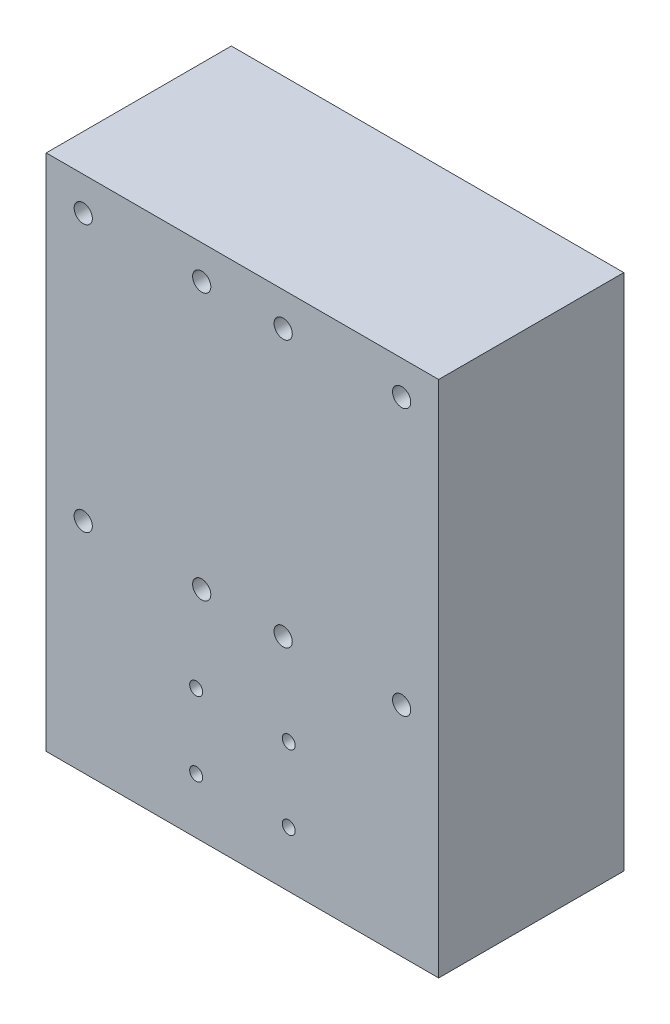
ISO-10303-21;
HEADER;
FILE_DESCRIPTION(('STEP AP214'),'2;1');
FILE_NAME('part.step','',(''),(''),'','','');
FILE_SCHEMA(('AUTOMOTIVE_DESIGN { 1 0 10303 214 1 1 1 1 }'));
ENDSEC;
DATA;
#1=APPLICATION_CONTEXT('core data for automotive mechanical design processes');
#2=APPLICATION_PROTOCOL_DEFINITION('international standard','automotive_design',2000,#1);
#3=PRODUCT_CONTEXT('',#1,'mechanical');
#4=PRODUCT('Part','Part','',(#3));
#5=PRODUCT_RELATED_PRODUCT_CATEGORY('part','',(#4));
#6=PRODUCT_DEFINITION_FORMATION('','',#4);
#7=PRODUCT_DEFINITION_CONTEXT('part definition',#1,'design');
#8=PRODUCT_DEFINITION('design','',#6,#7);
#9=PRODUCT_DEFINITION_SHAPE('','',#8);
#10=(LENGTH_UNIT() NAMED_UNIT(*) SI_UNIT(.MILLI.,.METRE.));
#11=(NAMED_UNIT(*) PLANE_ANGLE_UNIT() SI_UNIT($,.RADIAN.));
#12=(NAMED_UNIT(*) SI_UNIT($,.STERADIAN.) SOLID_ANGLE_UNIT());
#13=UNCERTAINTY_MEASURE_WITH_UNIT(LENGTH_MEASURE(1.E-05),#10,'distance_accuracy_value','');
#14=(GEOMETRIC_REPRESENTATION_CONTEXT(3) GLOBAL_UNCERTAINTY_ASSIGNED_CONTEXT((#13)) GLOBAL_UNIT_ASSIGNED_CONTEXT((#10,
#11,#12)) REPRESENTATION_CONTEXT('',''));
#15=CARTESIAN_POINT('',(0.,0.,0.));
#16=DIRECTION('',(0.,0.,1.));
#17=DIRECTION('',(1.,0.,0.));
#18=AXIS2_PLACEMENT_3D('',#15,#16,#17);
#19=CARTESIAN_POINT('',(0.,0.,50.));
#20=DIRECTION('',(0.,0.,1.));
#21=DIRECTION('',(1.,0.,0.));
#22=AXIS2_PLACEMENT_3D('',#19,#20,#21);
#23=PLANE('',#22);
#24=CARTESIAN_POINT('',(-12.5,-35.,50.));
#25=DIRECTION('',(0.,0.,1.));
#26=DIRECTION('',(1.,0.,0.));
#27=AXIS2_PLACEMENT_3D('',#24,#25,#26);
#28=CIRCLE('',#27,1.75);
#29=CARTESIAN_POINT('',(-10.75,-35.,50.));
#30=VERTEX_POINT('',#29);
#31=EDGE_CURVE('E360',#30,#30,#28,.T.);
#32=ORIENTED_EDGE('',*,*,#31,.F.);
#33=EDGE_LOOP('',(#32));
#34=FACE_BOUND('',#33,.T.);
#35=CARTESIAN_POINT('',(12.5,-55.,50.));
#36=DIRECTION('',(0.,0.,1.));
#37=DIRECTION('',(1.,0.,0.));
#38=AXIS2_PLACEMENT_3D('',#35,#36,#37);
#39=CIRCLE('',#38,1.75);
#40=CARTESIAN_POINT('',(14.25,-55.,50.));
#41=VERTEX_POINT('',#40);
#42=EDGE_CURVE('E353',#41,#41,#39,.T.);
#43=ORIENTED_EDGE('',*,*,#42,.F.);
#44=EDGE_LOOP('',(#43));
#45=FACE_BOUND('',#44,.T.);
#46=CARTESIAN_POINT('',(-12.5,-55.,50.));
#47=DIRECTION('',(0.,0.,1.));
#48=DIRECTION('',(1.,0.,0.));
#49=AXIS2_PLACEMENT_3D('',#46,#47,#48);
#50=CIRCLE('',#49,1.75);
#51=CARTESIAN_POINT('',(-10.75,-55.,50.));
#52=VERTEX_POINT('',#51);
#53=EDGE_CURVE('E365',#52,#52,#50,.T.);
#54=ORIENTED_EDGE('',*,*,#53,.F.);
#55=EDGE_LOOP('',(#54));
#56=FACE_BOUND('',#55,.T.);
#57=CARTESIAN_POINT('',(12.5,-35.,50.));
#58=DIRECTION('',(0.,0.,1.));
#59=DIRECTION('',(1.,0.,0.));
#60=AXIS2_PLACEMENT_3D('',#57,#58,#59);
#61=CIRCLE('',#60,1.75);
#62=CARTESIAN_POINT('',(14.25,-35.,50.));
#63=VERTEX_POINT('',#62);
#64=EDGE_CURVE('E347',#63,#63,#61,.T.);
#65=ORIENTED_EDGE('',*,*,#64,.F.);
#66=EDGE_LOOP('',(#65));
#67=FACE_BOUND('',#66,.T.);
#68=CARTESIAN_POINT('',(-11.,-11.1,50.));
#69=DIRECTION('',(0.,0.,1.));
#70=DIRECTION('',(1.,0.,0.));
#71=AXIS2_PLACEMENT_3D('',#68,#69,#70);
#72=CIRCLE('',#71,2.4585);
#73=CARTESIAN_POINT('',(-8.84246327159,-12.2786676867,50.));
#74=VERTEX_POINT('',#73);
#75=CARTESIAN_POINT('',(-13.1575367284,-9.92133231334,50.));
#76=VERTEX_POINT('',#75);
#77=EDGE_CURVE('E127',#74,#76,#72,.T.);
#78=ORIENTED_EDGE('',*,*,#77,.F.);
#79=CARTESIAN_POINT('',(-11.,-11.1,50.));
#80=DIRECTION('',(0.,0.,1.));
#81=DIRECTION('',(1.,0.,0.));
#82=AXIS2_PLACEMENT_3D('',#79,#80,#81);
#83=CIRCLE('',#82,2.4585);
#84=EDGE_CURVE('E296',#76,#74,#83,.T.);
#85=ORIENTED_EDGE('',*,*,#84,.F.);
#86=EDGE_LOOP('',(#78,#85));
#87=FACE_BOUND('',#86,.T.);
#88=CARTESIAN_POINT('',(-11.,60.9,50.));
#89=DIRECTION('',(0.,0.,1.));
#90=DIRECTION('',(1.,0.,0.));
#91=AXIS2_PLACEMENT_3D('',#88,#89,#90);
#92=CIRCLE('',#91,2.4585);
#93=CARTESIAN_POINT('',(-8.84246327159,59.7213323133,50.));
#94=VERTEX_POINT('',#93);
#95=CARTESIAN_POINT('',(-13.1575367284,62.0786676867,50.));
#96=VERTEX_POINT('',#95);
#97=EDGE_CURVE('E248',#94,#96,#92,.T.);
#98=ORIENTED_EDGE('',*,*,#97,.F.);
#99=CARTESIAN_POINT('',(-11.,60.9,50.));
#100=DIRECTION('',(0.,0.,1.));
#101=DIRECTION('',(1.,0.,0.));
#102=AXIS2_PLACEMENT_3D('',#99,#100,#101);
#103=CIRCLE('',#102,2.4585);
#104=EDGE_CURVE('E227',#96,#94,#103,.T.);
#105=ORIENTED_EDGE('',*,*,#104,.F.);
#106=EDGE_LOOP('',(#98,#105));
#107=FACE_BOUND('',#106,.T.);
#108=CARTESIAN_POINT('',(11.,-11.1,50.));
#109=DIRECTION('',(0.,0.,1.));
#110=DIRECTION('',(1.,0.,0.));
#111=AXIS2_PLACEMENT_3D('',#108,#109,#110);
#112=CIRCLE('',#111,2.4585);
#113=CARTESIAN_POINT('',(13.1575367284,-12.2786676867,50.));
#114=VERTEX_POINT('',#113);
#115=CARTESIAN_POINT('',(8.84246327159,-9.92133231334,50.));
#116=VERTEX_POINT('',#115);
#117=EDGE_CURVE('E211',#114,#116,#112,.T.);
#118=ORIENTED_EDGE('',*,*,#117,.F.);
#119=CARTESIAN_POINT('',(11.,-11.1,50.));
#120=DIRECTION('',(0.,0.,1.));
#121=DIRECTION('',(1.,0.,0.));
#122=AXIS2_PLACEMENT_3D('',#119,#120,#121);
#123=CIRCLE('',#122,2.4585);
#124=EDGE_CURVE('E253',#116,#114,#123,.T.);
#125=ORIENTED_EDGE('',*,*,#124,.F.);
#126=EDGE_LOOP('',(#118,#125));
#127=FACE_BOUND('',#126,.T.);
#128=CARTESIAN_POINT('',(-43.,-11.1,50.));
#129=DIRECTION('',(0.,0.,1.));
#130=DIRECTION('',(1.,0.,0.));
#131=AXIS2_PLACEMENT_3D('',#128,#129,#130);
#132=CIRCLE('',#131,2.4585);
#133=CARTESIAN_POINT('',(-40.8424632716,-12.2786676867,50.));
#134=VERTEX_POINT('',#133);
#135=CARTESIAN_POINT('',(-45.1575367284,-9.92133231334,50.));
#136=VERTEX_POINT('',#135);
#137=EDGE_CURVE('E310',#134,#136,#132,.T.);
#138=ORIENTED_EDGE('',*,*,#137,.F.);
#139=CARTESIAN_POINT('',(-43.,-11.1,50.));
#140=DIRECTION('',(0.,0.,1.));
#141=DIRECTION('',(1.,0.,0.));
#142=AXIS2_PLACEMENT_3D('',#139,#140,#141);
#143=CIRCLE('',#142,2.4585);
#144=EDGE_CURVE('E249',#136,#134,#143,.T.);
#145=ORIENTED_EDGE('',*,*,#144,.F.);
#146=EDGE_LOOP('',(#138,#145));
#147=FACE_BOUND('',#146,.T.);
#148=CARTESIAN_POINT('',(-43.,60.9,50.));
#149=DIRECTION('',(0.,0.,1.));
#150=DIRECTION('',(1.,0.,0.));
#151=AXIS2_PLACEMENT_3D('',#148,#149,#150);
#152=CIRCLE('',#151,2.4585);
#153=CARTESIAN_POINT('',(-40.8424632716,59.7213323133,50.));
#154=VERTEX_POINT('',#153);
#155=CARTESIAN_POINT('',(-45.1575367284,62.0786676867,50.));
#156=VERTEX_POINT('',#155);
#157=EDGE_CURVE('E258',#154,#156,#152,.T.);
#158=ORIENTED_EDGE('',*,*,#157,.F.);
#159=CARTESIAN_POINT('',(-43.,60.9,50.));
#160=DIRECTION('',(0.,0.,1.));
#161=DIRECTION('',(1.,0.,0.));
#162=AXIS2_PLACEMENT_3D('',#159,#160,#161);
#163=CIRCLE('',#162,2.4585);
#164=EDGE_CURVE('E217',#156,#154,#163,.T.);
#165=ORIENTED_EDGE('',*,*,#164,.F.);
#166=EDGE_LOOP('',(#158,#165));
#167=FACE_BOUND('',#166,.T.);
#168=CARTESIAN_POINT('',(43.,-11.1,50.));
#169=DIRECTION('',(0.,0.,1.));
#170=DIRECTION('',(1.,0.,0.));
#171=AXIS2_PLACEMENT_3D('',#168,#169,#170);
#172=CIRCLE('',#171,2.4585);
#173=CARTESIAN_POINT('',(45.1575367284,-12.2786676867,50.));
#174=VERTEX_POINT('',#173);
#175=CARTESIAN_POINT('',(40.8424632716,-9.92133231334,50.));
#176=VERTEX_POINT('',#175);
#177=EDGE_CURVE('E231',#174,#176,#172,.T.);
#178=ORIENTED_EDGE('',*,*,#177,.F.);
#179=CARTESIAN_POINT('',(43.,-11.1,50.));
#180=DIRECTION('',(0.,0.,1.));
#181=DIRECTION('',(1.,0.,0.));
#182=AXIS2_PLACEMENT_3D('',#179,#180,#181);
#183=CIRCLE('',#182,2.4585);
#184=EDGE_CURVE('E222',#176,#174,#183,.T.);
#185=ORIENTED_EDGE('',*,*,#184,.F.);
#186=EDGE_LOOP('',(#178,#185));
#187=FACE_BOUND('',#186,.T.);
#188=CARTESIAN_POINT('',(43.,60.9,50.));
#189=DIRECTION('',(0.,0.,1.));
#190=DIRECTION('',(1.,0.,0.));
#191=AXIS2_PLACEMENT_3D('',#188,#189,#190);
#192=CIRCLE('',#191,2.4585);
#193=CARTESIAN_POINT('',(40.8424632716,62.0786676867,50.));
#194=VERTEX_POINT('',#193);
#195=CARTESIAN_POINT('',(45.1575367284,59.7213323133,50.));
#196=VERTEX_POINT('',#195);
#197=EDGE_CURVE('E266',#194,#196,#192,.T.);
#198=ORIENTED_EDGE('',*,*,#197,.F.);
#199=CARTESIAN_POINT('',(43.,60.9,50.));
#200=DIRECTION('',(0.,0.,1.));
#201=DIRECTION('',(1.,0.,0.));
#202=AXIS2_PLACEMENT_3D('',#199,#200,#201);
#203=CIRCLE('',#202,2.4585);
#204=EDGE_CURVE('E228',#196,#194,#203,.T.);
#205=ORIENTED_EDGE('',*,*,#204,.F.);
#206=EDGE_LOOP('',(#198,#205));
#207=FACE_BOUND('',#206,.T.);
#208=CARTESIAN_POINT('',(11.,60.9,50.));
#209=DIRECTION('',(0.,0.,1.));
#210=DIRECTION('',(1.,0.,0.));
#211=AXIS2_PLACEMENT_3D('',#208,#209,#210);
#212=CIRCLE('',#211,2.4585);
#213=CARTESIAN_POINT('',(8.84246327159,62.0786676867,50.));
#214=VERTEX_POINT('',#213);
#215=CARTESIAN_POINT('',(13.1575367284,59.7213323133,50.));
#216=VERTEX_POINT('',#215);
#217=EDGE_CURVE('E11',#214,#216,#212,.T.);
#218=ORIENTED_EDGE('',*,*,#217,.F.);
#219=CARTESIAN_POINT('',(11.,60.9,50.));
#220=DIRECTION('',(0.,0.,1.));
#221=DIRECTION('',(1.,0.,0.));
#222=AXIS2_PLACEMENT_3D('',#219,#220,#221);
#223=CIRCLE('',#222,2.4585);
#224=EDGE_CURVE('E262',#216,#214,#223,.T.);
#225=ORIENTED_EDGE('',*,*,#224,.F.);
#226=EDGE_LOOP('',(#218,#225));
#227=FACE_BOUND('',#226,.T.);
#228=DIRECTION('',(0.,-1.,0.));
#229=VECTOR('',#228,1.);
#230=CARTESIAN_POINT('',(-53.,0.,50.));
#231=LINE('',#230,#229);
#232=CARTESIAN_POINT('',(-53.,70.,50.));
#233=VERTEX_POINT('',#232);
#234=CARTESIAN_POINT('',(-53.,-70.,50.));
#235=VERTEX_POINT('',#234);
#236=EDGE_CURVE('E190',#233,#235,#231,.T.);
#237=ORIENTED_EDGE('',*,*,#236,.T.);
#238=DIRECTION('',(1.,0.,0.));
#239=VECTOR('',#238,1.);
#240=CARTESIAN_POINT('',(-1.63424829225E-13,-70.,50.));
#241=LINE('',#240,#239);
#242=CARTESIAN_POINT('',(53.,-70.,50.));
#243=VERTEX_POINT('',#242);
#244=EDGE_CURVE('E188',#235,#243,#241,.T.);
#245=ORIENTED_EDGE('',*,*,#244,.T.);
#246=DIRECTION('',(0.,1.,0.));
#247=VECTOR('',#246,1.);
#248=CARTESIAN_POINT('',(53.,0.,50.));
#249=LINE('',#248,#247);
#250=CARTESIAN_POINT('',(53.,70.,50.));
#251=VERTEX_POINT('',#250);
#252=EDGE_CURVE('E175',#243,#251,#249,.T.);
#253=ORIENTED_EDGE('',*,*,#252,.T.);
#254=DIRECTION('',(-1.,0.,0.));
#255=VECTOR('',#254,1.);
#256=CARTESIAN_POINT('',(0.,70.,50.));
#257=LINE('',#256,#255);
#258=EDGE_CURVE('E245',#251,#233,#257,.T.);
#259=ORIENTED_EDGE('',*,*,#258,.T.);
#260=EDGE_LOOP('',(#237,#245,#253,#259));
#261=FACE_BOUND('',#260,.T.);
#262=ADVANCED_FACE('F42',(#34,#45,#56,#67,#87,#107,#127,#147,#167,#187,#207,#227,#261),#23,.T.);
#263=CARTESIAN_POINT('',(0.,0.,0.));
#264=DIRECTION('',(0.,0.,1.));
#265=DIRECTION('',(1.,0.,0.));
#266=AXIS2_PLACEMENT_3D('',#263,#264,#265);
#267=PLANE('',#266);
#268=CARTESIAN_POINT('',(-12.5,-35.,0.));
#269=DIRECTION('',(0.,0.,1.));
#270=DIRECTION('',(1.,0.,0.));
#271=AXIS2_PLACEMENT_3D('',#268,#269,#270);
#272=CIRCLE('',#271,1.75);
#273=CARTESIAN_POINT('',(-10.75,-35.,0.));
#274=VERTEX_POINT('',#273);
#275=EDGE_CURVE('E350',#274,#274,#272,.T.);
#276=ORIENTED_EDGE('',*,*,#275,.T.);
#277=EDGE_LOOP('',(#276));
#278=FACE_BOUND('',#277,.T.);
#279=CARTESIAN_POINT('',(12.5,-55.,0.));
#280=DIRECTION('',(0.,0.,1.));
#281=DIRECTION('',(1.,0.,0.));
#282=AXIS2_PLACEMENT_3D('',#279,#280,#281);
#283=CIRCLE('',#282,1.75);
#284=CARTESIAN_POINT('',(14.25,-55.,0.));
#285=VERTEX_POINT('',#284);
#286=EDGE_CURVE('E356',#285,#285,#283,.T.);
#287=ORIENTED_EDGE('',*,*,#286,.T.);
#288=EDGE_LOOP('',(#287));
#289=FACE_BOUND('',#288,.T.);
#290=CARTESIAN_POINT('',(-12.5,-55.,0.));
#291=DIRECTION('',(0.,0.,1.));
#292=DIRECTION('',(1.,0.,0.));
#293=AXIS2_PLACEMENT_3D('',#290,#291,#292);
#294=CIRCLE('',#293,1.75);
#295=CARTESIAN_POINT('',(-10.75,-55.,0.));
#296=VERTEX_POINT('',#295);
#297=EDGE_CURVE('E357',#296,#296,#294,.T.);
#298=ORIENTED_EDGE('',*,*,#297,.T.);
#299=EDGE_LOOP('',(#298));
#300=FACE_BOUND('',#299,.T.);
#301=CARTESIAN_POINT('',(12.5,-35.,0.));
#302=DIRECTION('',(0.,0.,1.));
#303=DIRECTION('',(1.,0.,0.));
#304=AXIS2_PLACEMENT_3D('',#301,#302,#303);
#305=CIRCLE('',#304,1.75);
#306=CARTESIAN_POINT('',(14.25,-35.,0.));
#307=VERTEX_POINT('',#306);
#308=EDGE_CURVE('E277',#307,#307,#305,.T.);
#309=ORIENTED_EDGE('',*,*,#308,.T.);
#310=EDGE_LOOP('',(#309));
#311=FACE_BOUND('',#310,.T.);
#312=DIRECTION('',(-1.,0.,0.));
#313=VECTOR('',#312,1.);
#314=CARTESIAN_POINT('',(0.,70.,0.));
#315=LINE('',#314,#313);
#316=CARTESIAN_POINT('',(53.,70.,0.));
#317=VERTEX_POINT('',#316);
#318=CARTESIAN_POINT('',(-53.,70.,0.));
#319=VERTEX_POINT('',#318);
#320=EDGE_CURVE('E185',#317,#319,#315,.T.);
#321=ORIENTED_EDGE('',*,*,#320,.F.);
#322=DIRECTION('',(0.,1.,0.));
#323=VECTOR('',#322,1.);
#324=CARTESIAN_POINT('',(53.,0.,0.));
#325=LINE('',#324,#323);
#326=CARTESIAN_POINT('',(53.,-70.,0.));
#327=VERTEX_POINT('',#326);
#328=EDGE_CURVE('E194',#327,#317,#325,.T.);
#329=ORIENTED_EDGE('',*,*,#328,.F.);
#330=DIRECTION('',(1.,0.,0.));
#331=VECTOR('',#330,1.);
#332=CARTESIAN_POINT('',(-1.63424829225E-13,-70.,0.));
#333=LINE('',#332,#331);
#334=CARTESIAN_POINT('',(-53.,-70.,0.));
#335=VERTEX_POINT('',#334);
#336=EDGE_CURVE('E197',#335,#327,#333,.T.);
#337=ORIENTED_EDGE('',*,*,#336,.F.);
#338=DIRECTION('',(0.,-1.,0.));
#339=VECTOR('',#338,1.);
#340=CARTESIAN_POINT('',(-53.,0.,0.));
#341=LINE('',#340,#339);
#342=EDGE_CURVE('E270',#319,#335,#341,.T.);
#343=ORIENTED_EDGE('',*,*,#342,.F.);
#344=EDGE_LOOP('',(#321,#329,#337,#343));
#345=FACE_BOUND('',#344,.T.);
#346=ADVANCED_FACE('F371',(#278,#289,#300,#311,#345),#267,.F.);
#347=CARTESIAN_POINT('',(11.,60.9,49.9));
#348=DIRECTION('',(0.,0.,-1.));
#349=DIRECTION('',(0.877582561890372,-0.479425538604204,0.));
#350=AXIS2_PLACEMENT_3D('',#347,#348,#349);
#351=CYLINDRICAL_SURFACE('',#350,2.4585);
#352=ORIENTED_EDGE('',*,*,#217,.T.);
#353=DIRECTION('',(0.,0.,1.));
#354=VECTOR('',#353,1.);
#355=CARTESIAN_POINT('',(13.1575367284,59.7213323133,35.1550000003));
#356=LINE('',#355,#354);
#357=CARTESIAN_POINT('',(13.1575367284,59.7213323133,20.));
#358=VERTEX_POINT('',#357);
#359=EDGE_CURVE('E52',#358,#216,#356,.T.);
#360=ORIENTED_EDGE('',*,*,#359,.F.);
#361=CARTESIAN_POINT('',(11.,60.9,20.));
#362=DIRECTION('',(0.,0.,-1.));
#363=DIRECTION('',(1.,0.,0.));
#364=AXIS2_PLACEMENT_3D('',#361,#362,#363);
#365=CIRCLE('',#364,2.4585);
#366=CARTESIAN_POINT('',(8.84246327159,62.0786676867,20.));
#367=VERTEX_POINT('',#366);
#368=EDGE_CURVE('E203',#358,#367,#365,.T.);
#369=ORIENTED_EDGE('',*,*,#368,.T.);
#370=DIRECTION('',(0.,0.,1.));
#371=VECTOR('',#370,1.);
#372=CARTESIAN_POINT('',(8.84246327159,62.0786676867,35.1550000003));
#373=LINE('',#372,#371);
#374=EDGE_CURVE('E265',#367,#214,#373,.T.);
#375=ORIENTED_EDGE('',*,*,#374,.T.);
#376=EDGE_LOOP('',(#352,#360,#369,#375));
#377=FACE_BOUND('',#376,.T.);
#378=ADVANCED_FACE('F442',(#377),#351,.F.);
#379=CARTESIAN_POINT('',(11.,60.9,49.9));
#380=DIRECTION('',(0.,0.,-1.));
#381=DIRECTION('',(0.877582561890372,-0.479425538604204,0.));
#382=AXIS2_PLACEMENT_3D('',#379,#380,#381);
#383=CYLINDRICAL_SURFACE('',#382,2.4585);
#384=ORIENTED_EDGE('',*,*,#224,.T.);
#385=ORIENTED_EDGE('',*,*,#374,.F.);
#386=CARTESIAN_POINT('',(11.,60.9,20.));
#387=DIRECTION('',(0.,0.,-1.));
#388=DIRECTION('',(1.,0.,0.));
#389=AXIS2_PLACEMENT_3D('',#386,#387,#388);
#390=CIRCLE('',#389,2.4585);
#391=EDGE_CURVE('E207',#367,#358,#390,.T.);
#392=ORIENTED_EDGE('',*,*,#391,.T.);
#393=ORIENTED_EDGE('',*,*,#359,.T.);
#394=EDGE_LOOP('',(#384,#385,#392,#393));
#395=FACE_BOUND('',#394,.T.);
#396=ADVANCED_FACE('F439',(#395),#383,.F.);
#397=CARTESIAN_POINT('',(43.,60.9,49.9));
#398=DIRECTION('',(0.,0.,-1.));
#399=DIRECTION('',(0.877582561890372,-0.479425538604204,0.));
#400=AXIS2_PLACEMENT_3D('',#397,#398,#399);
#401=CYLINDRICAL_SURFACE('',#400,2.4585);
#402=ORIENTED_EDGE('',*,*,#197,.T.);
#403=DIRECTION('',(0.,0.,1.));
#404=VECTOR('',#403,1.);
#405=CARTESIAN_POINT('',(45.1575367284,59.7213323133,35.1550000003));
#406=LINE('',#405,#404);
#407=CARTESIAN_POINT('',(45.1575367284,59.7213323133,20.));
#408=VERTEX_POINT('',#407);
#409=EDGE_CURVE('E283',#408,#196,#406,.T.);
#410=ORIENTED_EDGE('',*,*,#409,.F.);
#411=CARTESIAN_POINT('',(43.,60.9,20.));
#412=DIRECTION('',(0.,0.,-1.));
#413=DIRECTION('',(1.,0.,0.));
#414=AXIS2_PLACEMENT_3D('',#411,#412,#413);
#415=CIRCLE('',#414,2.4585);
#416=CARTESIAN_POINT('',(40.8424632716,62.0786676867,20.));
#417=VERTEX_POINT('',#416);
#418=EDGE_CURVE('E273',#408,#417,#415,.T.);
#419=ORIENTED_EDGE('',*,*,#418,.T.);
#420=DIRECTION('',(0.,0.,1.));
#421=VECTOR('',#420,1.);
#422=CARTESIAN_POINT('',(40.8424632716,62.0786676867,35.1550000003));
#423=LINE('',#422,#421);
#424=EDGE_CURVE('E46',#417,#194,#423,.T.);
#425=ORIENTED_EDGE('',*,*,#424,.T.);
#426=EDGE_LOOP('',(#402,#410,#419,#425));
#427=FACE_BOUND('',#426,.T.);
#428=ADVANCED_FACE('F401',(#427),#401,.F.);
#429=CARTESIAN_POINT('',(43.,60.9,49.9));
#430=DIRECTION('',(0.,0.,-1.));
#431=DIRECTION('',(0.877582561890372,-0.479425538604204,0.));
#432=AXIS2_PLACEMENT_3D('',#429,#430,#431);
#433=CYLINDRICAL_SURFACE('',#432,2.4585);
#434=ORIENTED_EDGE('',*,*,#204,.T.);
#435=ORIENTED_EDGE('',*,*,#424,.F.);
#436=CARTESIAN_POINT('',(43.,60.9,20.));
#437=DIRECTION('',(0.,0.,-1.));
#438=DIRECTION('',(1.,0.,0.));
#439=AXIS2_PLACEMENT_3D('',#436,#437,#438);
#440=CIRCLE('',#439,2.4585);
#441=EDGE_CURVE('E206',#417,#408,#440,.T.);
#442=ORIENTED_EDGE('',*,*,#441,.T.);
#443=ORIENTED_EDGE('',*,*,#409,.T.);
#444=EDGE_LOOP('',(#434,#435,#442,#443));
#445=FACE_BOUND('',#444,.T.);
#446=ADVANCED_FACE('F405',(#445),#433,.F.);
#447=CARTESIAN_POINT('',(43.,-11.1,49.9));
#448=DIRECTION('',(0.,0.,-1.));
#449=DIRECTION('',(0.877582561890372,-0.479425538604204,0.));
#450=AXIS2_PLACEMENT_3D('',#447,#448,#449);
#451=CYLINDRICAL_SURFACE('',#450,2.4585);
#452=ORIENTED_EDGE('',*,*,#177,.T.);
#453=DIRECTION('',(0.,0.,1.));
#454=VECTOR('',#453,1.);
#455=CARTESIAN_POINT('',(40.8424632716,-9.92133231334,35.1550000003));
#456=LINE('',#455,#454);
#457=CARTESIAN_POINT('',(40.8424632716,-9.92133231334,20.));
#458=VERTEX_POINT('',#457);
#459=EDGE_CURVE('E221',#458,#176,#456,.T.);
#460=ORIENTED_EDGE('',*,*,#459,.F.);
#461=CARTESIAN_POINT('',(43.,-11.1,20.));
#462=DIRECTION('',(0.,0.,-1.));
#463=DIRECTION('',(1.,0.,0.));
#464=AXIS2_PLACEMENT_3D('',#461,#462,#463);
#465=CIRCLE('',#464,2.4585);
#466=CARTESIAN_POINT('',(45.1575367284,-12.2786676867,20.));
#467=VERTEX_POINT('',#466);
#468=EDGE_CURVE('E236',#458,#467,#465,.T.);
#469=ORIENTED_EDGE('',*,*,#468,.T.);
#470=DIRECTION('',(0.,0.,1.));
#471=VECTOR('',#470,1.);
#472=CARTESIAN_POINT('',(45.1575367284,-12.2786676867,35.1550000003));
#473=LINE('',#472,#471);
#474=EDGE_CURVE('E218',#467,#174,#473,.T.);
#475=ORIENTED_EDGE('',*,*,#474,.T.);
#476=EDGE_LOOP('',(#452,#460,#469,#475));
#477=FACE_BOUND('',#476,.T.);
#478=ADVANCED_FACE('F460',(#477),#451,.F.);
#479=CARTESIAN_POINT('',(43.,-11.1,49.9));
#480=DIRECTION('',(0.,0.,-1.));
#481=DIRECTION('',(0.877582561890372,-0.479425538604204,0.));
#482=AXIS2_PLACEMENT_3D('',#479,#480,#481);
#483=CYLINDRICAL_SURFACE('',#482,2.4585);
#484=ORIENTED_EDGE('',*,*,#184,.T.);
#485=ORIENTED_EDGE('',*,*,#474,.F.);
#486=CARTESIAN_POINT('',(43.,-11.1,20.));
#487=DIRECTION('',(0.,0.,-1.));
#488=DIRECTION('',(1.,0.,0.));
#489=AXIS2_PLACEMENT_3D('',#486,#487,#488);
#490=CIRCLE('',#489,2.4585);
#491=EDGE_CURVE('E232',#467,#458,#490,.T.);
#492=ORIENTED_EDGE('',*,*,#491,.T.);
#493=ORIENTED_EDGE('',*,*,#459,.T.);
#494=EDGE_LOOP('',(#484,#485,#492,#493));
#495=FACE_BOUND('',#494,.T.);
#496=ADVANCED_FACE('F462',(#495),#483,.F.);
#497=CARTESIAN_POINT('',(-43.,60.9,49.9));
#498=DIRECTION('',(0.,0.,-1.));
#499=DIRECTION('',(0.877582561890372,-0.479425538604204,0.));
#500=AXIS2_PLACEMENT_3D('',#497,#498,#499);
#501=CYLINDRICAL_SURFACE('',#500,2.4585);
#502=ORIENTED_EDGE('',*,*,#157,.T.);
#503=DIRECTION('',(0.,0.,1.));
#504=VECTOR('',#503,1.);
#505=CARTESIAN_POINT('',(-45.1575367284,62.0786676867,35.1550000003));
#506=LINE('',#505,#504);
#507=CARTESIAN_POINT('',(-45.1575367284,62.0786676867,20.));
#508=VERTEX_POINT('',#507);
#509=EDGE_CURVE('E216',#508,#156,#506,.T.);
#510=ORIENTED_EDGE('',*,*,#509,.F.);
#511=CARTESIAN_POINT('',(-43.,60.9,20.));
#512=DIRECTION('',(0.,0.,-1.));
#513=DIRECTION('',(1.,0.,0.));
#514=AXIS2_PLACEMENT_3D('',#511,#512,#513);
#515=CIRCLE('',#514,2.4585);
#516=CARTESIAN_POINT('',(-40.8424632716,59.7213323133,20.));
#517=VERTEX_POINT('',#516);
#518=EDGE_CURVE('E235',#508,#517,#515,.T.);
#519=ORIENTED_EDGE('',*,*,#518,.T.);
#520=DIRECTION('',(0.,0.,1.));
#521=VECTOR('',#520,1.);
#522=CARTESIAN_POINT('',(-40.8424632716,59.7213323133,35.1550000003));
#523=LINE('',#522,#521);
#524=EDGE_CURVE('E213',#517,#154,#523,.T.);
#525=ORIENTED_EDGE('',*,*,#524,.T.);
#526=EDGE_LOOP('',(#502,#510,#519,#525));
#527=FACE_BOUND('',#526,.T.);
#528=ADVANCED_FACE('F411',(#527),#501,.F.);
#529=CARTESIAN_POINT('',(-43.,60.9,49.9));
#530=DIRECTION('',(0.,0.,-1.));
#531=DIRECTION('',(0.877582561890372,-0.479425538604204,0.));
#532=AXIS2_PLACEMENT_3D('',#529,#530,#531);
#533=CYLINDRICAL_SURFACE('',#532,2.4585);
#534=ORIENTED_EDGE('',*,*,#164,.T.);
#535=ORIENTED_EDGE('',*,*,#524,.F.);
#536=CARTESIAN_POINT('',(-43.,60.9,20.));
#537=DIRECTION('',(0.,0.,-1.));
#538=DIRECTION('',(1.,0.,0.));
#539=AXIS2_PLACEMENT_3D('',#536,#537,#538);
#540=CIRCLE('',#539,2.4585);
#541=EDGE_CURVE('E288',#517,#508,#540,.T.);
#542=ORIENTED_EDGE('',*,*,#541,.T.);
#543=ORIENTED_EDGE('',*,*,#509,.T.);
#544=EDGE_LOOP('',(#534,#535,#542,#543));
#545=FACE_BOUND('',#544,.T.);
#546=ADVANCED_FACE('F413',(#545),#533,.F.);
#547=CARTESIAN_POINT('',(-43.,-11.1,49.9));
#548=DIRECTION('',(0.,0.,-1.));
#549=DIRECTION('',(0.877582561890372,-0.479425538604204,0.));
#550=AXIS2_PLACEMENT_3D('',#547,#548,#549);
#551=CYLINDRICAL_SURFACE('',#550,2.4585);
#552=ORIENTED_EDGE('',*,*,#137,.T.);
#553=DIRECTION('',(0.,0.,1.));
#554=VECTOR('',#553,1.);
#555=CARTESIAN_POINT('',(-45.1575367284,-9.92133231334,35.1550000003));
#556=LINE('',#555,#554);
#557=CARTESIAN_POINT('',(-45.1575367284,-9.92133231334,20.));
#558=VERTEX_POINT('',#557);
#559=EDGE_CURVE('E307',#558,#136,#556,.T.);
#560=ORIENTED_EDGE('',*,*,#559,.F.);
#561=CARTESIAN_POINT('',(-43.,-11.1,20.));
#562=DIRECTION('',(0.,0.,-1.));
#563=DIRECTION('',(1.,0.,0.));
#564=AXIS2_PLACEMENT_3D('',#561,#562,#563);
#565=CIRCLE('',#564,2.4585);
#566=CARTESIAN_POINT('',(-40.8424632716,-12.2786676867,20.));
#567=VERTEX_POINT('',#566);
#568=EDGE_CURVE('E291',#558,#567,#565,.T.);
#569=ORIENTED_EDGE('',*,*,#568,.T.);
#570=DIRECTION('',(0.,0.,1.));
#571=VECTOR('',#570,1.);
#572=CARTESIAN_POINT('',(-40.8424632716,-12.2786676867,35.1550000003));
#573=LINE('',#572,#571);
#574=EDGE_CURVE('E252',#567,#134,#573,.T.);
#575=ORIENTED_EDGE('',*,*,#574,.T.);
#576=EDGE_LOOP('',(#552,#560,#569,#575));
#577=FACE_BOUND('',#576,.T.);
#578=ADVANCED_FACE('F450',(#577),#551,.F.);
#579=CARTESIAN_POINT('',(-43.,-11.1,49.9));
#580=DIRECTION('',(0.,0.,-1.));
#581=DIRECTION('',(0.877582561890372,-0.479425538604204,0.));
#582=AXIS2_PLACEMENT_3D('',#579,#580,#581);
#583=CYLINDRICAL_SURFACE('',#582,2.4585);
#584=ORIENTED_EDGE('',*,*,#144,.T.);
#585=ORIENTED_EDGE('',*,*,#574,.F.);
#586=CARTESIAN_POINT('',(-43.,-11.1,20.));
#587=DIRECTION('',(0.,0.,-1.));
#588=DIRECTION('',(1.,0.,0.));
#589=AXIS2_PLACEMENT_3D('',#586,#587,#588);
#590=CIRCLE('',#589,2.4585);
#591=EDGE_CURVE('E280',#567,#558,#590,.T.);
#592=ORIENTED_EDGE('',*,*,#591,.T.);
#593=ORIENTED_EDGE('',*,*,#559,.T.);
#594=EDGE_LOOP('',(#584,#585,#592,#593));
#595=FACE_BOUND('',#594,.T.);
#596=ADVANCED_FACE('F433',(#595),#583,.F.);
#597=CARTESIAN_POINT('',(11.,-11.1,49.9));
#598=DIRECTION('',(0.,0.,-1.));
#599=DIRECTION('',(0.877582561890372,-0.479425538604204,0.));
#600=AXIS2_PLACEMENT_3D('',#597,#598,#599);
#601=CYLINDRICAL_SURFACE('',#600,2.4585);
#602=ORIENTED_EDGE('',*,*,#117,.T.);
#603=DIRECTION('',(0.,0.,1.));
#604=VECTOR('',#603,1.);
#605=CARTESIAN_POINT('',(8.84246327159,-9.92133231334,35.1550000003));
#606=LINE('',#605,#604);
#607=CARTESIAN_POINT('',(8.84246327159,-9.92133231334,20.));
#608=VERTEX_POINT('',#607);
#609=EDGE_CURVE('E208',#608,#116,#606,.T.);
#610=ORIENTED_EDGE('',*,*,#609,.F.);
#611=CARTESIAN_POINT('',(11.,-11.1,20.));
#612=DIRECTION('',(0.,0.,-1.));
#613=DIRECTION('',(1.,0.,0.));
#614=AXIS2_PLACEMENT_3D('',#611,#612,#613);
#615=CIRCLE('',#614,2.4585);
#616=CARTESIAN_POINT('',(13.1575367284,-12.2786676867,20.));
#617=VERTEX_POINT('',#616);
#618=EDGE_CURVE('E241',#608,#617,#615,.T.);
#619=ORIENTED_EDGE('',*,*,#618,.T.);
#620=DIRECTION('',(0.,0.,1.));
#621=VECTOR('',#620,1.);
#622=CARTESIAN_POINT('',(13.1575367284,-12.2786676867,35.1550000003));
#623=LINE('',#622,#621);
#624=EDGE_CURVE('E212',#617,#114,#623,.T.);
#625=ORIENTED_EDGE('',*,*,#624,.T.);
#626=EDGE_LOOP('',(#602,#610,#619,#625));
#627=FACE_BOUND('',#626,.T.);
#628=ADVANCED_FACE('F480',(#627),#601,.F.);
#629=CARTESIAN_POINT('',(11.,-11.1,49.9));
#630=DIRECTION('',(0.,0.,-1.));
#631=DIRECTION('',(0.877582561890372,-0.479425538604204,0.));
#632=AXIS2_PLACEMENT_3D('',#629,#630,#631);
#633=CYLINDRICAL_SURFACE('',#632,2.4585);
#634=ORIENTED_EDGE('',*,*,#124,.T.);
#635=ORIENTED_EDGE('',*,*,#624,.F.);
#636=CARTESIAN_POINT('',(11.,-11.1,20.));
#637=DIRECTION('',(0.,0.,-1.));
#638=DIRECTION('',(1.,0.,0.));
#639=AXIS2_PLACEMENT_3D('',#636,#637,#638);
#640=CIRCLE('',#639,2.4585);
#641=EDGE_CURVE('E237',#617,#608,#640,.T.);
#642=ORIENTED_EDGE('',*,*,#641,.T.);
#643=ORIENTED_EDGE('',*,*,#609,.T.);
#644=EDGE_LOOP('',(#634,#635,#642,#643));
#645=FACE_BOUND('',#644,.T.);
#646=ADVANCED_FACE('F483',(#645),#633,.F.);
#647=CARTESIAN_POINT('',(-11.,60.9,49.9));
#648=DIRECTION('',(0.,0.,-1.));
#649=DIRECTION('',(0.877582561890372,-0.479425538604204,0.));
#650=AXIS2_PLACEMENT_3D('',#647,#648,#649);
#651=CYLINDRICAL_SURFACE('',#650,2.4585);
#652=ORIENTED_EDGE('',*,*,#97,.T.);
#653=DIRECTION('',(0.,0.,1.));
#654=VECTOR('',#653,1.);
#655=CARTESIAN_POINT('',(-13.1575367284,62.0786676867,35.1550000003));
#656=LINE('',#655,#654);
#657=CARTESIAN_POINT('',(-13.1575367284,62.0786676867,20.));
#658=VERTEX_POINT('',#657);
#659=EDGE_CURVE('E226',#658,#96,#656,.T.);
#660=ORIENTED_EDGE('',*,*,#659,.F.);
#661=CARTESIAN_POINT('',(-11.,60.9,20.));
#662=DIRECTION('',(0.,0.,-1.));
#663=DIRECTION('',(1.,0.,0.));
#664=AXIS2_PLACEMENT_3D('',#661,#662,#663);
#665=CIRCLE('',#664,2.4585);
#666=CARTESIAN_POINT('',(-8.84246327159,59.7213323133,20.));
#667=VERTEX_POINT('',#666);
#668=EDGE_CURVE('E240',#658,#667,#665,.T.);
#669=ORIENTED_EDGE('',*,*,#668,.T.);
#670=DIRECTION('',(0.,0.,1.));
#671=VECTOR('',#670,1.);
#672=CARTESIAN_POINT('',(-8.84246327159,59.7213323133,35.1550000003));
#673=LINE('',#672,#671);
#674=EDGE_CURVE('E223',#667,#94,#673,.T.);
#675=ORIENTED_EDGE('',*,*,#674,.T.);
#676=EDGE_LOOP('',(#652,#660,#669,#675));
#677=FACE_BOUND('',#676,.T.);
#678=ADVANCED_FACE('F492',(#677),#651,.F.);
#679=CARTESIAN_POINT('',(-11.,60.9,49.9));
#680=DIRECTION('',(0.,0.,-1.));
#681=DIRECTION('',(0.877582561890372,-0.479425538604204,0.));
#682=AXIS2_PLACEMENT_3D('',#679,#680,#681);
#683=CYLINDRICAL_SURFACE('',#682,2.4585);
#684=ORIENTED_EDGE('',*,*,#104,.T.);
#685=ORIENTED_EDGE('',*,*,#674,.F.);
#686=CARTESIAN_POINT('',(-11.,60.9,20.));
#687=DIRECTION('',(0.,0.,-1.));
#688=DIRECTION('',(1.,0.,0.));
#689=AXIS2_PLACEMENT_3D('',#686,#687,#688);
#690=CIRCLE('',#689,2.4585);
#691=EDGE_CURVE('E302',#667,#658,#690,.T.);
#692=ORIENTED_EDGE('',*,*,#691,.T.);
#693=ORIENTED_EDGE('',*,*,#659,.T.);
#694=EDGE_LOOP('',(#684,#685,#692,#693));
#695=FACE_BOUND('',#694,.T.);
#696=ADVANCED_FACE('F495',(#695),#683,.F.);
#697=CARTESIAN_POINT('',(-11.,-11.1,49.9));
#698=DIRECTION('',(0.,0.,-1.));
#699=DIRECTION('',(0.877582561890372,-0.479425538604204,0.));
#700=AXIS2_PLACEMENT_3D('',#697,#698,#699);
#701=CYLINDRICAL_SURFACE('',#700,2.4585);
#702=ORIENTED_EDGE('',*,*,#77,.T.);
#703=DIRECTION('',(0.,0.,1.));
#704=VECTOR('',#703,1.);
#705=CARTESIAN_POINT('',(-13.1575367284,-9.92133231334,35.1550000003));
#706=LINE('',#705,#704);
#707=CARTESIAN_POINT('',(-13.1575367284,-9.92133231334,20.));
#708=VERTEX_POINT('',#707);
#709=EDGE_CURVE('E295',#708,#76,#706,.T.);
#710=ORIENTED_EDGE('',*,*,#709,.F.);
#711=CARTESIAN_POINT('',(-11.,-11.1,20.));
#712=DIRECTION('',(0.,0.,-1.));
#713=DIRECTION('',(1.,0.,0.));
#714=AXIS2_PLACEMENT_3D('',#711,#712,#713);
#715=CIRCLE('',#714,2.4585);
#716=CARTESIAN_POINT('',(-8.84246327159,-12.2786676867,20.));
#717=VERTEX_POINT('',#716);
#718=EDGE_CURVE('E318',#708,#717,#715,.T.);
#719=ORIENTED_EDGE('',*,*,#718,.T.);
#720=DIRECTION('',(0.,0.,1.));
#721=VECTOR('',#720,1.);
#722=CARTESIAN_POINT('',(-8.84246327159,-12.2786676867,35.1550000003));
#723=LINE('',#722,#721);
#724=EDGE_CURVE('E293',#717,#74,#723,.T.);
#725=ORIENTED_EDGE('',*,*,#724,.T.);
#726=EDGE_LOOP('',(#702,#710,#719,#725));
#727=FACE_BOUND('',#726,.T.);
#728=ADVANCED_FACE('F44',(#727),#701,.F.);
#729=CARTESIAN_POINT('',(-11.,-11.1,49.9));
#730=DIRECTION('',(0.,0.,-1.));
#731=DIRECTION('',(0.877582561890372,-0.479425538604204,0.));
#732=AXIS2_PLACEMENT_3D('',#729,#730,#731);
#733=CYLINDRICAL_SURFACE('',#732,2.4585);
#734=ORIENTED_EDGE('',*,*,#84,.T.);
#735=ORIENTED_EDGE('',*,*,#724,.F.);
#736=CARTESIAN_POINT('',(-11.,-11.1,20.));
#737=DIRECTION('',(0.,0.,-1.));
#738=DIRECTION('',(1.,0.,0.));
#739=AXIS2_PLACEMENT_3D('',#736,#737,#738);
#740=CIRCLE('',#739,2.4585);
#741=EDGE_CURVE('E321',#717,#708,#740,.T.);
#742=ORIENTED_EDGE('',*,*,#741,.T.);
#743=ORIENTED_EDGE('',*,*,#709,.T.);
#744=EDGE_LOOP('',(#734,#735,#742,#743));
#745=FACE_BOUND('',#744,.T.);
#746=ADVANCED_FACE('F458',(#745),#733,.F.);
#747=CARTESIAN_POINT('',(43.,60.9,20.));
#748=DIRECTION('',(0.,0.,-1.));
#749=DIRECTION('',(0.,-1.,0.));
#750=AXIS2_PLACEMENT_3D('',#747,#748,#749);
#751=PLANE('',#750);
#752=ORIENTED_EDGE('',*,*,#718,.F.);
#753=ORIENTED_EDGE('',*,*,#741,.F.);
#754=EDGE_LOOP('',(#752,#753));
#755=FACE_BOUND('',#754,.T.);
#756=ADVANCED_FACE('F456',(#755),#751,.F.);
#757=CARTESIAN_POINT('',(43.,60.9,20.));
#758=DIRECTION('',(0.,0.,-1.));
#759=DIRECTION('',(0.,-1.,0.));
#760=AXIS2_PLACEMENT_3D('',#757,#758,#759);
#761=PLANE('',#760);
#762=ORIENTED_EDGE('',*,*,#668,.F.);
#763=ORIENTED_EDGE('',*,*,#691,.F.);
#764=EDGE_LOOP('',(#762,#763));
#765=FACE_BOUND('',#764,.T.);
#766=ADVANCED_FACE('F437',(#765),#761,.F.);
#767=CARTESIAN_POINT('',(43.,60.9,20.));
#768=DIRECTION('',(0.,0.,-1.));
#769=DIRECTION('',(0.,-1.,0.));
#770=AXIS2_PLACEMENT_3D('',#767,#768,#769);
#771=PLANE('',#770);
#772=ORIENTED_EDGE('',*,*,#618,.F.);
#773=ORIENTED_EDGE('',*,*,#641,.F.);
#774=EDGE_LOOP('',(#772,#773));
#775=FACE_BOUND('',#774,.T.);
#776=ADVANCED_FACE('F428',(#775),#771,.F.);
#777=CARTESIAN_POINT('',(43.,60.9,20.));
#778=DIRECTION('',(0.,0.,-1.));
#779=DIRECTION('',(0.,-1.,0.));
#780=AXIS2_PLACEMENT_3D('',#777,#778,#779);
#781=PLANE('',#780);
#782=ORIENTED_EDGE('',*,*,#568,.F.);
#783=ORIENTED_EDGE('',*,*,#591,.F.);
#784=EDGE_LOOP('',(#782,#783));
#785=FACE_BOUND('',#784,.T.);
#786=ADVANCED_FACE('F420',(#785),#781,.F.);
#787=CARTESIAN_POINT('',(43.,60.9,20.));
#788=DIRECTION('',(0.,0.,-1.));
#789=DIRECTION('',(0.,-1.,0.));
#790=AXIS2_PLACEMENT_3D('',#787,#788,#789);
#791=PLANE('',#790);
#792=ORIENTED_EDGE('',*,*,#518,.F.);
#793=ORIENTED_EDGE('',*,*,#541,.F.);
#794=EDGE_LOOP('',(#792,#793));
#795=FACE_BOUND('',#794,.T.);
#796=ADVANCED_FACE('F417',(#795),#791,.F.);
#797=CARTESIAN_POINT('',(43.,60.9,20.));
#798=DIRECTION('',(0.,0.,-1.));
#799=DIRECTION('',(0.,-1.,0.));
#800=AXIS2_PLACEMENT_3D('',#797,#798,#799);
#801=PLANE('',#800);
#802=ORIENTED_EDGE('',*,*,#468,.F.);
#803=ORIENTED_EDGE('',*,*,#491,.F.);
#804=EDGE_LOOP('',(#802,#803));
#805=FACE_BOUND('',#804,.T.);
#806=ADVANCED_FACE('F419',(#805),#801,.F.);
#807=CARTESIAN_POINT('',(43.,60.9,20.));
#808=DIRECTION('',(0.,0.,-1.));
#809=DIRECTION('',(0.,-1.,0.));
#810=AXIS2_PLACEMENT_3D('',#807,#808,#809);
#811=PLANE('',#810);
#812=ORIENTED_EDGE('',*,*,#441,.F.);
#813=ORIENTED_EDGE('',*,*,#418,.F.);
#814=EDGE_LOOP('',(#812,#813));
#815=FACE_BOUND('',#814,.T.);
#816=ADVANCED_FACE('F407',(#815),#811,.F.);
#817=CARTESIAN_POINT('',(43.,60.9,20.));
#818=DIRECTION('',(0.,0.,-1.));
#819=DIRECTION('',(0.,-1.,0.));
#820=AXIS2_PLACEMENT_3D('',#817,#818,#819);
#821=PLANE('',#820);
#822=ORIENTED_EDGE('',*,*,#391,.F.);
#823=ORIENTED_EDGE('',*,*,#368,.F.);
#824=EDGE_LOOP('',(#822,#823));
#825=FACE_BOUND('',#824,.T.);
#826=ADVANCED_FACE('F454',(#825),#821,.F.);
#827=CARTESIAN_POINT('',(-53.,70.,0.));
#828=DIRECTION('',(0.,-1.,0.));
#829=DIRECTION('',(0.,0.,-1.));
#830=AXIS2_PLACEMENT_3D('',#827,#828,#829);
#831=PLANE('',#830);
#832=DIRECTION('',(0.,0.,1.));
#833=VECTOR('',#832,1.);
#834=CARTESIAN_POINT('',(53.,70.,25.));
#835=LINE('',#834,#833);
#836=EDGE_CURVE('E183',#317,#251,#835,.T.);
#837=ORIENTED_EDGE('',*,*,#836,.F.);
#838=ORIENTED_EDGE('',*,*,#320,.T.);
#839=DIRECTION('',(0.,0.,1.));
#840=VECTOR('',#839,1.);
#841=CARTESIAN_POINT('',(-53.,70.,25.));
#842=LINE('',#841,#840);
#843=EDGE_CURVE('E274',#319,#233,#842,.T.);
#844=ORIENTED_EDGE('',*,*,#843,.T.);
#845=ORIENTED_EDGE('',*,*,#258,.F.);
#846=EDGE_LOOP('',(#837,#838,#844,#845));
#847=FACE_BOUND('',#846,.T.);
#848=ADVANCED_FACE('F451',(#847),#831,.F.);
#849=CARTESIAN_POINT('',(53.,-70.,0.));
#850=DIRECTION('',(1.,0.,0.));
#851=DIRECTION('',(0.,1.,0.));
#852=AXIS2_PLACEMENT_3D('',#849,#850,#851);
#853=PLANE('',#852);
#854=DIRECTION('',(0.,0.,1.));
#855=VECTOR('',#854,1.);
#856=CARTESIAN_POINT('',(53.,-70.,25.));
#857=LINE('',#856,#855);
#858=EDGE_CURVE('E180',#327,#243,#857,.T.);
#859=ORIENTED_EDGE('',*,*,#858,.F.);
#860=ORIENTED_EDGE('',*,*,#328,.T.);
#861=ORIENTED_EDGE('',*,*,#836,.T.);
#862=ORIENTED_EDGE('',*,*,#252,.F.);
#863=EDGE_LOOP('',(#859,#860,#861,#862));
#864=FACE_BOUND('',#863,.T.);
#865=ADVANCED_FACE('F177',(#864),#853,.T.);
#866=CARTESIAN_POINT('',(53.,-70.,0.));
#867=DIRECTION('',(0.,1.,0.));
#868=DIRECTION('',(1.,0.,0.));
#869=AXIS2_PLACEMENT_3D('',#866,#867,#868);
#870=PLANE('',#869);
#871=DIRECTION('',(0.,0.,1.));
#872=VECTOR('',#871,1.);
#873=CARTESIAN_POINT('',(-53.,-70.,25.));
#874=LINE('',#873,#872);
#875=EDGE_CURVE('E268',#335,#235,#874,.T.);
#876=ORIENTED_EDGE('',*,*,#875,.F.);
#877=ORIENTED_EDGE('',*,*,#336,.T.);
#878=ORIENTED_EDGE('',*,*,#858,.T.);
#879=ORIENTED_EDGE('',*,*,#244,.F.);
#880=EDGE_LOOP('',(#876,#877,#878,#879));
#881=FACE_BOUND('',#880,.T.);
#882=ADVANCED_FACE('F196',(#881),#870,.F.);
#883=CARTESIAN_POINT('',(-53.,70.,0.));
#884=DIRECTION('',(-1.,0.,0.));
#885=DIRECTION('',(0.,0.,1.));
#886=AXIS2_PLACEMENT_3D('',#883,#884,#885);
#887=PLANE('',#886);
#888=ORIENTED_EDGE('',*,*,#843,.F.);
#889=ORIENTED_EDGE('',*,*,#342,.T.);
#890=ORIENTED_EDGE('',*,*,#875,.T.);
#891=ORIENTED_EDGE('',*,*,#236,.F.);
#892=EDGE_LOOP('',(#888,#889,#890,#891));
#893=FACE_BOUND('',#892,.T.);
#894=ADVANCED_FACE('F444',(#893),#887,.T.);
#895=CARTESIAN_POINT('',(12.5,-35.,0.));
#896=DIRECTION('',(0.,0.,1.));
#897=DIRECTION('',(1.,0.,0.));
#898=AXIS2_PLACEMENT_3D('',#895,#896,#897);
#899=CYLINDRICAL_SURFACE('',#898,1.75);
#900=ORIENTED_EDGE('',*,*,#308,.F.);
#901=EDGE_LOOP('',(#900));
#902=FACE_BOUND('',#901,.T.);
#903=ORIENTED_EDGE('',*,*,#64,.T.);
#904=EDGE_LOOP('',(#903));
#905=FACE_BOUND('',#904,.T.);
#906=ADVANCED_FACE('F378',(#902,#905),#899,.F.);
#907=CARTESIAN_POINT('',(-12.5,-55.,0.));
#908=DIRECTION('',(0.,0.,1.));
#909=DIRECTION('',(1.,0.,0.));
#910=AXIS2_PLACEMENT_3D('',#907,#908,#909);
#911=CYLINDRICAL_SURFACE('',#910,1.75);
#912=ORIENTED_EDGE('',*,*,#297,.F.);
#913=EDGE_LOOP('',(#912));
#914=FACE_BOUND('',#913,.T.);
#915=ORIENTED_EDGE('',*,*,#53,.T.);
#916=EDGE_LOOP('',(#915));
#917=FACE_BOUND('',#916,.T.);
#918=ADVANCED_FACE('F374',(#914,#917),#911,.F.);
#919=CARTESIAN_POINT('',(12.5,-55.,0.));
#920=DIRECTION('',(0.,0.,1.));
#921=DIRECTION('',(1.,0.,0.));
#922=AXIS2_PLACEMENT_3D('',#919,#920,#921);
#923=CYLINDRICAL_SURFACE('',#922,1.75);
#924=ORIENTED_EDGE('',*,*,#286,.F.);
#925=EDGE_LOOP('',(#924));
#926=FACE_BOUND('',#925,.T.);
#927=ORIENTED_EDGE('',*,*,#42,.T.);
#928=EDGE_LOOP('',(#927));
#929=FACE_BOUND('',#928,.T.);
#930=ADVANCED_FACE('F377',(#926,#929),#923,.F.);
#931=CARTESIAN_POINT('',(-12.5,-35.,0.));
#932=DIRECTION('',(0.,0.,1.));
#933=DIRECTION('',(1.,0.,0.));
#934=AXIS2_PLACEMENT_3D('',#931,#932,#933);
#935=CYLINDRICAL_SURFACE('',#934,1.75);
#936=ORIENTED_EDGE('',*,*,#275,.F.);
#937=EDGE_LOOP('',(#936));
#938=FACE_BOUND('',#937,.T.);
#939=ORIENTED_EDGE('',*,*,#31,.T.);
#940=EDGE_LOOP('',(#939));
#941=FACE_BOUND('',#940,.T.);
#942=ADVANCED_FACE('F522',(#938,#941),#935,.F.);
#943=CLOSED_SHELL('',(#262,#346,#378,#396,#428,#446,#478,#496,#528,#546,#578,#596,#628,#646,
#678,#696,#728,#746,#756,#766,#776,#786,#796,#806,#816,#826,#848,#865,#882,#894,#906,#918,#930,#942));
#944=MANIFOLD_SOLID_BREP('B2',#943);
#945=ADVANCED_BREP_SHAPE_REPRESENTATION('',(#18,#944),#14);
#946=SHAPE_DEFINITION_REPRESENTATION(#9,#945);
ENDSEC;
END-ISO-10303-21;
